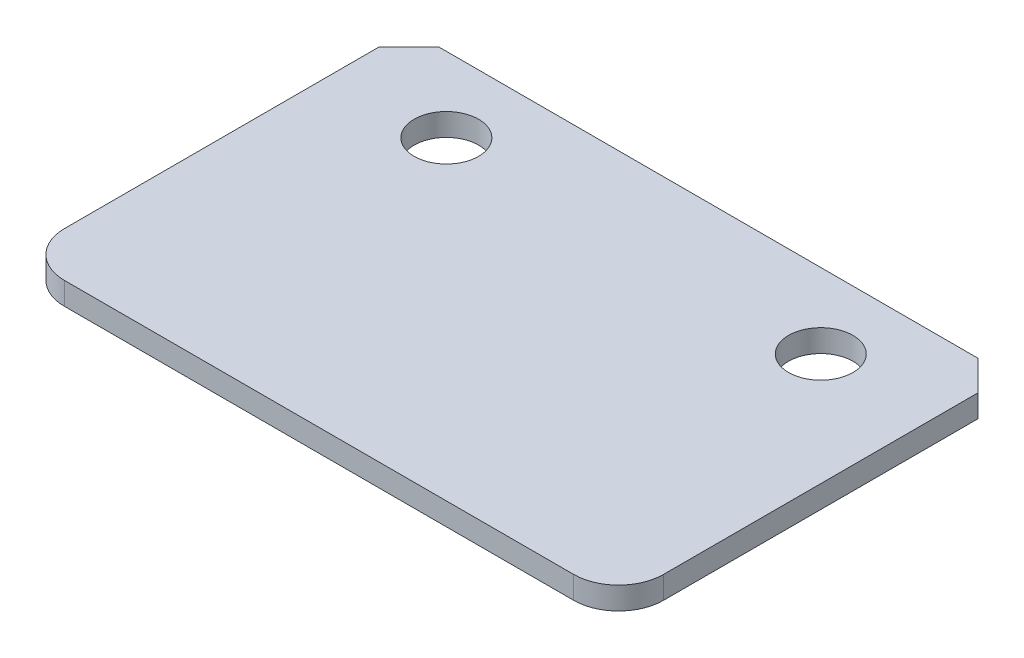
ISO-10303-21;
HEADER;
FILE_DESCRIPTION(('STEP AP214'),'2;1');
FILE_NAME('part.step','',(''),(''),'','','');
FILE_SCHEMA(('AUTOMOTIVE_DESIGN { 1 0 10303 214 1 1 1 1 }'));
ENDSEC;
DATA;
#1=APPLICATION_CONTEXT('core data for automotive mechanical design processes');
#2=APPLICATION_PROTOCOL_DEFINITION('international standard','automotive_design',2000,#1);
#3=PRODUCT_CONTEXT('',#1,'mechanical');
#4=PRODUCT('Part','Part','',(#3));
#5=PRODUCT_RELATED_PRODUCT_CATEGORY('part','',(#4));
#6=PRODUCT_DEFINITION_FORMATION('','',#4);
#7=PRODUCT_DEFINITION_CONTEXT('part definition',#1,'design');
#8=PRODUCT_DEFINITION('design','',#6,#7);
#9=PRODUCT_DEFINITION_SHAPE('','',#8);
#10=(LENGTH_UNIT() NAMED_UNIT(*) SI_UNIT(.MILLI.,.METRE.));
#11=(NAMED_UNIT(*) PLANE_ANGLE_UNIT() SI_UNIT($,.RADIAN.));
#12=(NAMED_UNIT(*) SI_UNIT($,.STERADIAN.) SOLID_ANGLE_UNIT());
#13=UNCERTAINTY_MEASURE_WITH_UNIT(LENGTH_MEASURE(1.E-05),#10,'distance_accuracy_value','');
#14=(GEOMETRIC_REPRESENTATION_CONTEXT(3) GLOBAL_UNCERTAINTY_ASSIGNED_CONTEXT((#13)) GLOBAL_UNIT_ASSIGNED_CONTEXT((#10,
#11,#12)) REPRESENTATION_CONTEXT('',''));
#15=CARTESIAN_POINT('',(0.,0.,0.));
#16=DIRECTION('',(0.,0.,1.));
#17=DIRECTION('',(1.,0.,0.));
#18=AXIS2_PLACEMENT_3D('',#15,#16,#17);
#19=CARTESIAN_POINT('',(-18.,-1.5,-13.));
#20=DIRECTION('',(0.707106781186549,0.,0.707106781186546));
#21=DIRECTION('',(0.,-1.,0.));
#22=AXIS2_PLACEMENT_3D('',#19,#20,#21);
#23=PLANE('',#22);
#24=DIRECTION('',(0.707106781186546,0.,-0.707106781186549));
#25=VECTOR('',#24,1.);
#26=CARTESIAN_POINT('',(-18.,-1.5,-13.));
#27=LINE('',#26,#25);
#28=CARTESIAN_POINT('',(-20.,-1.5,-11.));
#29=VERTEX_POINT('',#28);
#30=CARTESIAN_POINT('',(-18.,-1.5,-13.));
#31=VERTEX_POINT('',#30);
#32=EDGE_CURVE('E94',#29,#31,#27,.T.);
#33=ORIENTED_EDGE('',*,*,#32,.F.);
#34=DIRECTION('',(0.,-1.,0.));
#35=VECTOR('',#34,1.);
#36=CARTESIAN_POINT('',(-20.,-1.5,-11.));
#37=LINE('',#36,#35);
#38=CARTESIAN_POINT('',(-20.,0.,-11.));
#39=VERTEX_POINT('',#38);
#40=EDGE_CURVE('E203',#39,#29,#37,.T.);
#41=ORIENTED_EDGE('',*,*,#40,.F.);
#42=DIRECTION('',(-0.707106781186546,0.,0.707106781186549));
#43=VECTOR('',#42,1.);
#44=CARTESIAN_POINT('',(-15.5,0.,-15.5));
#45=LINE('',#44,#43);
#46=CARTESIAN_POINT('',(-18.,0.,-13.));
#47=VERTEX_POINT('',#46);
#48=EDGE_CURVE('E109',#47,#39,#45,.T.);
#49=ORIENTED_EDGE('',*,*,#48,.F.);
#50=DIRECTION('',(0.,1.,0.));
#51=VECTOR('',#50,1.);
#52=CARTESIAN_POINT('',(-18.,-1.5,-13.));
#53=LINE('',#52,#51);
#54=EDGE_CURVE('E178',#31,#47,#53,.T.);
#55=ORIENTED_EDGE('',*,*,#54,.F.);
#56=EDGE_LOOP('',(#33,#41,#49,#55));
#57=FACE_BOUND('',#56,.T.);
#58=ADVANCED_FACE('F17',(#57),#23,.F.);
#59=CARTESIAN_POINT('',(20.,-1.5,-11.));
#60=DIRECTION('',(-0.707106781186546,0.,0.707106781186549));
#61=DIRECTION('',(0.,1.,0.));
#62=AXIS2_PLACEMENT_3D('',#59,#60,#61);
#63=PLANE('',#62);
#64=DIRECTION('',(0.707106781186549,0.,0.707106781186546));
#65=VECTOR('',#64,1.);
#66=CARTESIAN_POINT('',(20.,-1.5,-11.));
#67=LINE('',#66,#65);
#68=CARTESIAN_POINT('',(18.,-1.5,-13.));
#69=VERTEX_POINT('',#68);
#70=CARTESIAN_POINT('',(20.,-1.5,-11.));
#71=VERTEX_POINT('',#70);
#72=EDGE_CURVE('E130',#69,#71,#67,.T.);
#73=ORIENTED_EDGE('',*,*,#72,.F.);
#74=DIRECTION('',(0.,-1.,0.));
#75=VECTOR('',#74,1.);
#76=CARTESIAN_POINT('',(18.,-1.5,-13.));
#77=LINE('',#76,#75);
#78=CARTESIAN_POINT('',(18.,0.,-13.));
#79=VERTEX_POINT('',#78);
#80=EDGE_CURVE('E179',#79,#69,#77,.T.);
#81=ORIENTED_EDGE('',*,*,#80,.F.);
#82=DIRECTION('',(-0.707106781186549,0.,-0.707106781186546));
#83=VECTOR('',#82,1.);
#84=CARTESIAN_POINT('',(15.5,0.,-15.5));
#85=LINE('',#84,#83);
#86=CARTESIAN_POINT('',(20.,0.,-11.));
#87=VERTEX_POINT('',#86);
#88=EDGE_CURVE('E101',#87,#79,#85,.T.);
#89=ORIENTED_EDGE('',*,*,#88,.F.);
#90=DIRECTION('',(0.,1.,0.));
#91=VECTOR('',#90,1.);
#92=CARTESIAN_POINT('',(20.,-1.5,-11.));
#93=LINE('',#92,#91);
#94=EDGE_CURVE('E168',#71,#87,#93,.T.);
#95=ORIENTED_EDGE('',*,*,#94,.F.);
#96=EDGE_LOOP('',(#73,#81,#89,#95));
#97=FACE_BOUND('',#96,.T.);
#98=ADVANCED_FACE('F19',(#97),#63,.F.);
#99=CARTESIAN_POINT('',(-12.5,-1.5,-8.));
#100=DIRECTION('',(0.,1.,0.));
#101=DIRECTION('',(0.,0.,1.));
#102=AXIS2_PLACEMENT_3D('',#99,#100,#101);
#103=CYLINDRICAL_SURFACE('',#102,2.15);
#104=CARTESIAN_POINT('',(-12.5,-1.5,-8.));
#105=DIRECTION('',(0.,1.,0.));
#106=DIRECTION('',(0.,0.,1.));
#107=AXIS2_PLACEMENT_3D('',#104,#105,#106);
#108=CIRCLE('',#107,2.15);
#109=CARTESIAN_POINT('',(-12.5,-1.5,-5.85));
#110=VERTEX_POINT('',#109);
#111=EDGE_CURVE('E88',#110,#110,#108,.T.);
#112=ORIENTED_EDGE('',*,*,#111,.F.);
#113=EDGE_LOOP('',(#112));
#114=FACE_BOUND('',#113,.T.);
#115=CARTESIAN_POINT('',(-12.5,0.,-8.));
#116=DIRECTION('',(0.,1.,0.));
#117=DIRECTION('',(0.,0.,1.));
#118=AXIS2_PLACEMENT_3D('',#115,#116,#117);
#119=CIRCLE('',#118,2.15);
#120=CARTESIAN_POINT('',(-12.5,0.,-5.85));
#121=VERTEX_POINT('',#120);
#122=EDGE_CURVE('E27',#121,#121,#119,.T.);
#123=ORIENTED_EDGE('',*,*,#122,.T.);
#124=EDGE_LOOP('',(#123));
#125=FACE_BOUND('',#124,.T.);
#126=ADVANCED_FACE('F380',(#114,#125),#103,.F.);
#127=CARTESIAN_POINT('',(12.5,-1.5,-8.));
#128=DIRECTION('',(0.,1.,0.));
#129=DIRECTION('',(0.,0.,1.));
#130=AXIS2_PLACEMENT_3D('',#127,#128,#129);
#131=CYLINDRICAL_SURFACE('',#130,2.15);
#132=CARTESIAN_POINT('',(12.5,-1.5,-8.));
#133=DIRECTION('',(0.,1.,0.));
#134=DIRECTION('',(0.,0.,1.));
#135=AXIS2_PLACEMENT_3D('',#132,#133,#134);
#136=CIRCLE('',#135,2.15);
#137=CARTESIAN_POINT('',(12.5,-1.5,-5.85));
#138=VERTEX_POINT('',#137);
#139=EDGE_CURVE('E93',#138,#138,#136,.T.);
#140=ORIENTED_EDGE('',*,*,#139,.F.);
#141=EDGE_LOOP('',(#140));
#142=FACE_BOUND('',#141,.T.);
#143=CARTESIAN_POINT('',(12.5,0.,-8.));
#144=DIRECTION('',(0.,1.,0.));
#145=DIRECTION('',(0.,0.,1.));
#146=AXIS2_PLACEMENT_3D('',#143,#144,#145);
#147=CIRCLE('',#146,2.15);
#148=CARTESIAN_POINT('',(12.5,0.,-5.85));
#149=VERTEX_POINT('',#148);
#150=EDGE_CURVE('E11',#149,#149,#147,.T.);
#151=ORIENTED_EDGE('',*,*,#150,.T.);
#152=EDGE_LOOP('',(#151));
#153=FACE_BOUND('',#152,.T.);
#154=ADVANCED_FACE('F384',(#142,#153),#131,.F.);
#155=CARTESIAN_POINT('',(-17.,-1.5,10.));
#156=DIRECTION('',(0.,1.,0.));
#157=DIRECTION('',(0.,0.,1.));
#158=AXIS2_PLACEMENT_3D('',#155,#156,#157);
#159=CYLINDRICAL_SURFACE('',#158,3.);
#160=CARTESIAN_POINT('',(-17.,-1.5,10.));
#161=DIRECTION('',(0.,-1.,0.));
#162=DIRECTION('',(0.,0.,1.));
#163=AXIS2_PLACEMENT_3D('',#160,#161,#162);
#164=CIRCLE('',#163,3.);
#165=CARTESIAN_POINT('',(-17.,-1.5,13.));
#166=VERTEX_POINT('',#165);
#167=CARTESIAN_POINT('',(-20.,-1.5,10.));
#168=VERTEX_POINT('',#167);
#169=EDGE_CURVE('E103',#166,#168,#164,.T.);
#170=ORIENTED_EDGE('',*,*,#169,.F.);
#171=DIRECTION('',(0.,-1.,0.));
#172=VECTOR('',#171,1.);
#173=CARTESIAN_POINT('',(-17.,-1.5,13.));
#174=LINE('',#173,#172);
#175=CARTESIAN_POINT('',(-17.,0.,13.));
#176=VERTEX_POINT('',#175);
#177=EDGE_CURVE('E145',#176,#166,#174,.T.);
#178=ORIENTED_EDGE('',*,*,#177,.F.);
#179=CARTESIAN_POINT('',(-17.,0.,10.));
#180=DIRECTION('',(0.,1.,0.));
#181=DIRECTION('',(0.,0.,1.));
#182=AXIS2_PLACEMENT_3D('',#179,#180,#181);
#183=CIRCLE('',#182,3.);
#184=CARTESIAN_POINT('',(-20.,0.,10.));
#185=VERTEX_POINT('',#184);
#186=EDGE_CURVE('E113',#185,#176,#183,.T.);
#187=ORIENTED_EDGE('',*,*,#186,.F.);
#188=DIRECTION('',(0.,1.,0.));
#189=VECTOR('',#188,1.);
#190=CARTESIAN_POINT('',(-20.,-1.5,10.));
#191=LINE('',#190,#189);
#192=EDGE_CURVE('E184',#168,#185,#191,.T.);
#193=ORIENTED_EDGE('',*,*,#192,.F.);
#194=EDGE_LOOP('',(#170,#178,#187,#193));
#195=FACE_BOUND('',#194,.T.);
#196=ADVANCED_FACE('F260',(#195),#159,.T.);
#197=CARTESIAN_POINT('',(17.,-1.5,10.));
#198=DIRECTION('',(0.,1.,0.));
#199=DIRECTION('',(0.,0.,1.));
#200=AXIS2_PLACEMENT_3D('',#197,#198,#199);
#201=CYLINDRICAL_SURFACE('',#200,3.);
#202=CARTESIAN_POINT('',(17.,-1.5,10.));
#203=DIRECTION('',(0.,-1.,0.));
#204=DIRECTION('',(0.,0.,1.));
#205=AXIS2_PLACEMENT_3D('',#202,#203,#204);
#206=CIRCLE('',#205,3.);
#207=CARTESIAN_POINT('',(20.,-1.5,10.));
#208=VERTEX_POINT('',#207);
#209=CARTESIAN_POINT('',(17.,-1.5,13.));
#210=VERTEX_POINT('',#209);
#211=EDGE_CURVE('E132',#208,#210,#206,.T.);
#212=ORIENTED_EDGE('',*,*,#211,.F.);
#213=DIRECTION('',(0.,-1.,0.));
#214=VECTOR('',#213,1.);
#215=CARTESIAN_POINT('',(20.,-1.5,10.));
#216=LINE('',#215,#214);
#217=CARTESIAN_POINT('',(20.,0.,10.));
#218=VERTEX_POINT('',#217);
#219=EDGE_CURVE('E185',#218,#208,#216,.T.);
#220=ORIENTED_EDGE('',*,*,#219,.F.);
#221=CARTESIAN_POINT('',(17.,0.,10.));
#222=DIRECTION('',(0.,1.,0.));
#223=DIRECTION('',(0.,0.,1.));
#224=AXIS2_PLACEMENT_3D('',#221,#222,#223);
#225=CIRCLE('',#224,3.);
#226=CARTESIAN_POINT('',(17.,0.,13.));
#227=VERTEX_POINT('',#226);
#228=EDGE_CURVE('E115',#227,#218,#225,.T.);
#229=ORIENTED_EDGE('',*,*,#228,.F.);
#230=DIRECTION('',(0.,1.,0.));
#231=VECTOR('',#230,1.);
#232=CARTESIAN_POINT('',(17.,-1.5,13.));
#233=LINE('',#232,#231);
#234=EDGE_CURVE('E161',#210,#227,#233,.T.);
#235=ORIENTED_EDGE('',*,*,#234,.F.);
#236=EDGE_LOOP('',(#212,#220,#229,#235));
#237=FACE_BOUND('',#236,.T.);
#238=ADVANCED_FACE('F267',(#237),#201,.T.);
#239=CARTESIAN_POINT('',(0.,0.,0.));
#240=DIRECTION('',(0.,1.,0.));
#241=DIRECTION('',(1.,0.,0.));
#242=AXIS2_PLACEMENT_3D('',#239,#240,#241);
#243=PLANE('',#242);
#244=ORIENTED_EDGE('',*,*,#150,.F.);
#245=EDGE_LOOP('',(#244));
#246=FACE_BOUND('',#245,.T.);
#247=ORIENTED_EDGE('',*,*,#122,.F.);
#248=EDGE_LOOP('',(#247));
#249=FACE_BOUND('',#248,.T.);
#250=DIRECTION('',(0.,0.,-1.));
#251=VECTOR('',#250,1.);
#252=CARTESIAN_POINT('',(20.,0.,13.));
#253=LINE('',#252,#251);
#254=EDGE_CURVE('E172',#218,#87,#253,.T.);
#255=ORIENTED_EDGE('',*,*,#254,.T.);
#256=ORIENTED_EDGE('',*,*,#88,.T.);
#257=DIRECTION('',(-1.,0.,0.));
#258=VECTOR('',#257,1.);
#259=CARTESIAN_POINT('',(20.,0.,-13.));
#260=LINE('',#259,#258);
#261=EDGE_CURVE('E180',#79,#47,#260,.T.);
#262=ORIENTED_EDGE('',*,*,#261,.T.);
#263=ORIENTED_EDGE('',*,*,#48,.T.);
#264=DIRECTION('',(0.,0.,1.));
#265=VECTOR('',#264,1.);
#266=CARTESIAN_POINT('',(-20.,0.,13.));
#267=LINE('',#266,#265);
#268=EDGE_CURVE('E207',#39,#185,#267,.T.);
#269=ORIENTED_EDGE('',*,*,#268,.T.);
#270=ORIENTED_EDGE('',*,*,#186,.T.);
#271=DIRECTION('',(1.,0.,0.));
#272=VECTOR('',#271,1.);
#273=CARTESIAN_POINT('',(20.,0.,13.));
#274=LINE('',#273,#272);
#275=EDGE_CURVE('E153',#176,#227,#274,.T.);
#276=ORIENTED_EDGE('',*,*,#275,.T.);
#277=ORIENTED_EDGE('',*,*,#228,.T.);
#278=EDGE_LOOP('',(#255,#256,#262,#263,#269,#270,#276,#277));
#279=FACE_BOUND('',#278,.T.);
#280=ADVANCED_FACE('F224',(#246,#249,#279),#243,.T.);
#281=CARTESIAN_POINT('',(0.,-1.5,0.));
#282=DIRECTION('',(0.,1.,0.));
#283=DIRECTION('',(1.,0.,0.));
#284=AXIS2_PLACEMENT_3D('',#281,#282,#283);
#285=PLANE('',#284);
#286=ORIENTED_EDGE('',*,*,#139,.T.);
#287=EDGE_LOOP('',(#286));
#288=FACE_BOUND('',#287,.T.);
#289=ORIENTED_EDGE('',*,*,#111,.T.);
#290=EDGE_LOOP('',(#289));
#291=FACE_BOUND('',#290,.T.);
#292=DIRECTION('',(-1.,0.,0.));
#293=VECTOR('',#292,1.);
#294=CARTESIAN_POINT('',(20.,-1.5,-13.));
#295=LINE('',#294,#293);
#296=EDGE_CURVE('E174',#69,#31,#295,.T.);
#297=ORIENTED_EDGE('',*,*,#296,.F.);
#298=ORIENTED_EDGE('',*,*,#72,.T.);
#299=DIRECTION('',(0.,0.,-1.));
#300=VECTOR('',#299,1.);
#301=CARTESIAN_POINT('',(20.,-1.5,13.));
#302=LINE('',#301,#300);
#303=EDGE_CURVE('E173',#208,#71,#302,.T.);
#304=ORIENTED_EDGE('',*,*,#303,.F.);
#305=ORIENTED_EDGE('',*,*,#211,.T.);
#306=DIRECTION('',(1.,0.,0.));
#307=VECTOR('',#306,1.);
#308=CARTESIAN_POINT('',(20.,-1.5,13.));
#309=LINE('',#308,#307);
#310=EDGE_CURVE('E167',#166,#210,#309,.T.);
#311=ORIENTED_EDGE('',*,*,#310,.F.);
#312=ORIENTED_EDGE('',*,*,#169,.T.);
#313=DIRECTION('',(0.,0.,1.));
#314=VECTOR('',#313,1.);
#315=CARTESIAN_POINT('',(-20.,-1.5,13.));
#316=LINE('',#315,#314);
#317=EDGE_CURVE('E194',#29,#168,#316,.T.);
#318=ORIENTED_EDGE('',*,*,#317,.F.);
#319=ORIENTED_EDGE('',*,*,#32,.T.);
#320=EDGE_LOOP('',(#297,#298,#304,#305,#311,#312,#318,#319));
#321=FACE_BOUND('',#320,.T.);
#322=ADVANCED_FACE('F89',(#288,#291,#321),#285,.F.);
#323=CARTESIAN_POINT('',(20.,-1.5,13.));
#324=DIRECTION('',(0.,0.,1.));
#325=DIRECTION('',(1.,0.,0.));
#326=AXIS2_PLACEMENT_3D('',#323,#324,#325);
#327=PLANE('',#326);
#328=ORIENTED_EDGE('',*,*,#310,.T.);
#329=ORIENTED_EDGE('',*,*,#234,.T.);
#330=ORIENTED_EDGE('',*,*,#275,.F.);
#331=ORIENTED_EDGE('',*,*,#177,.T.);
#332=EDGE_LOOP('',(#328,#329,#330,#331));
#333=FACE_BOUND('',#332,.T.);
#334=ADVANCED_FACE('F265',(#333),#327,.T.);
#335=CARTESIAN_POINT('',(20.,-1.5,13.));
#336=DIRECTION('',(1.,0.,0.));
#337=DIRECTION('',(0.,1.,0.));
#338=AXIS2_PLACEMENT_3D('',#335,#336,#337);
#339=PLANE('',#338);
#340=ORIENTED_EDGE('',*,*,#303,.T.);
#341=ORIENTED_EDGE('',*,*,#94,.T.);
#342=ORIENTED_EDGE('',*,*,#254,.F.);
#343=ORIENTED_EDGE('',*,*,#219,.T.);
#344=EDGE_LOOP('',(#340,#341,#342,#343));
#345=FACE_BOUND('',#344,.T.);
#346=ADVANCED_FACE('F269',(#345),#339,.T.);
#347=CARTESIAN_POINT('',(20.,-1.5,-13.));
#348=DIRECTION('',(0.,0.,-1.));
#349=DIRECTION('',(-1.,0.,0.));
#350=AXIS2_PLACEMENT_3D('',#347,#348,#349);
#351=PLANE('',#350);
#352=ORIENTED_EDGE('',*,*,#261,.F.);
#353=ORIENTED_EDGE('',*,*,#80,.T.);
#354=ORIENTED_EDGE('',*,*,#296,.T.);
#355=ORIENTED_EDGE('',*,*,#54,.T.);
#356=EDGE_LOOP('',(#352,#353,#354,#355));
#357=FACE_BOUND('',#356,.T.);
#358=ADVANCED_FACE('F221',(#357),#351,.T.);
#359=CARTESIAN_POINT('',(-20.,-1.5,13.));
#360=DIRECTION('',(-1.,0.,0.));
#361=DIRECTION('',(0.,0.,1.));
#362=AXIS2_PLACEMENT_3D('',#359,#360,#361);
#363=PLANE('',#362);
#364=ORIENTED_EDGE('',*,*,#268,.F.);
#365=ORIENTED_EDGE('',*,*,#40,.T.);
#366=ORIENTED_EDGE('',*,*,#317,.T.);
#367=ORIENTED_EDGE('',*,*,#192,.T.);
#368=EDGE_LOOP('',(#364,#365,#366,#367));
#369=FACE_BOUND('',#368,.T.);
#370=ADVANCED_FACE('F263',(#369),#363,.T.);
#371=CLOSED_SHELL('',(#58,#98,#126,#154,#196,#238,#280,#322,#334,#346,#358,#370));
#372=MANIFOLD_SOLID_BREP('B1',#371);
#373=ADVANCED_BREP_SHAPE_REPRESENTATION('',(#18,#372),#14);
#374=SHAPE_DEFINITION_REPRESENTATION(#9,#373);
ENDSEC;
END-ISO-10303-21;
